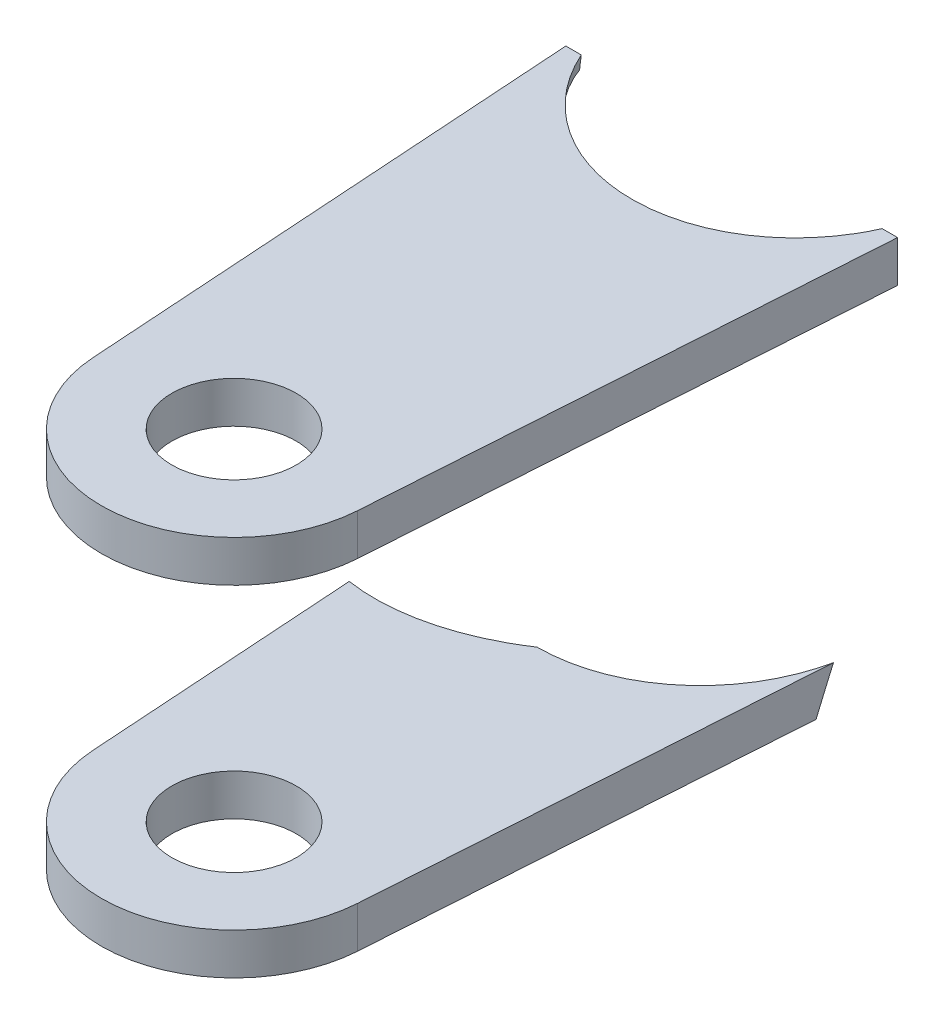
ISO-10303-21;
HEADER;
FILE_DESCRIPTION(('STEP AP214'),'2;1');
FILE_NAME('part.step','',(''),(''),'','','');
FILE_SCHEMA(('AUTOMOTIVE_DESIGN { 1 0 10303 214 1 1 1 1 }'));
ENDSEC;
DATA;
#1=APPLICATION_CONTEXT('core data for automotive mechanical design processes');
#2=APPLICATION_PROTOCOL_DEFINITION('international standard','automotive_design',2000,#1);
#3=PRODUCT_CONTEXT('',#1,'mechanical');
#4=PRODUCT('Part','Part','',(#3));
#5=PRODUCT_RELATED_PRODUCT_CATEGORY('part','',(#4));
#6=PRODUCT_DEFINITION_FORMATION('','',#4);
#7=PRODUCT_DEFINITION_CONTEXT('part definition',#1,'design');
#8=PRODUCT_DEFINITION('design','',#6,#7);
#9=PRODUCT_DEFINITION_SHAPE('','',#8);
#10=(LENGTH_UNIT() NAMED_UNIT(*) SI_UNIT(.MILLI.,.METRE.));
#11=(NAMED_UNIT(*) PLANE_ANGLE_UNIT() SI_UNIT($,.RADIAN.));
#12=(NAMED_UNIT(*) SI_UNIT($,.STERADIAN.) SOLID_ANGLE_UNIT());
#13=UNCERTAINTY_MEASURE_WITH_UNIT(LENGTH_MEASURE(1.E-05),#10,'distance_accuracy_value','');
#14=(GEOMETRIC_REPRESENTATION_CONTEXT(3) GLOBAL_UNCERTAINTY_ASSIGNED_CONTEXT((#13)) GLOBAL_UNIT_ASSIGNED_CONTEXT((#10,
#11,#12)) REPRESENTATION_CONTEXT('',''));
#15=CARTESIAN_POINT('',(0.,0.,0.));
#16=DIRECTION('',(0.,0.,1.));
#17=DIRECTION('',(1.,0.,0.));
#18=AXIS2_PLACEMENT_3D('',#15,#16,#17);
#19=CARTESIAN_POINT('',(0.,-11.43,0.));
#20=DIRECTION('',(0.,1.,0.));
#21=DIRECTION('',(0.,0.,1.));
#22=AXIS2_PLACEMENT_3D('',#19,#20,#21);
#23=PLANE('',#22);
#24=CARTESIAN_POINT('',(0.,-11.43,0.));
#25=DIRECTION('',(0.,1.,0.));
#26=DIRECTION('',(0.,0.,1.));
#27=AXIS2_PLACEMENT_3D('',#24,#25,#26);
#28=CIRCLE('',#27,4.7625);
#29=CARTESIAN_POINT('',(0.,-11.43,4.7625));
#30=VERTEX_POINT('',#29);
#31=EDGE_CURVE('E219',#30,#30,#28,.T.);
#32=ORIENTED_EDGE('',*,*,#31,.F.);
#33=EDGE_LOOP('',(#32));
#34=FACE_BOUND('',#33,.T.);
#35=DIRECTION('',(0.065941170815567,0.,-0.997823512446701));
#36=VECTOR('',#35,1.);
#37=CARTESIAN_POINT('',(10.1378868864585,-11.43,0.669962295486161));
#38=LINE('',#37,#36);
#39=CARTESIAN_POINT('',(10.1378868864585,-11.43,0.669962295486162));
#40=VERTEX_POINT('',#39);
#41=CARTESIAN_POINT('',(12.395699428603,-11.43,-33.4953158362905));
#42=VERTEX_POINT('',#41);
#43=EDGE_CURVE('E214',#40,#42,#38,.T.);
#44=ORIENTED_EDGE('',*,*,#43,.T.);
#45=CARTESIAN_POINT('',(6.84625654488924E-13,-11.43,-36.3650046202835));
#46=DIRECTION('',(0.,1.,0.));
#47=DIRECTION('',(0.,0.,-1.));
#48=AXIS2_PLACEMENT_3D('',#45,#46,#47);
#49=ELLIPSE('',#48,13.1882595385154,12.7);
#50=CARTESIAN_POINT('',(0.0187698506159406,-11.4299999999997,-23.1767594853977));
#51=VERTEX_POINT('',#50);
#52=EDGE_CURVE('E150',#42,#51,#49,.F.);
#53=ORIENTED_EDGE('',*,*,#52,.T.);
#54=CARTESIAN_POINT('',(-6.3980891267826,-11.43,-34.2101718485152));
#55=DIRECTION('',(0.,1.,0.));
#56=DIRECTION('',(-0.766871698259869,0.,0.641800435032593));
#57=AXIS2_PLACEMENT_3D('',#54,#55,#56);
#58=ELLIPSE('',#57,15.7233905378156,12.7);
#59=CARTESIAN_POINT('',(-11.5267302875876,-11.43,-20.3460521854983));
#60=VERTEX_POINT('',#59);
#61=EDGE_CURVE('E224',#51,#60,#58,.F.);
#62=ORIENTED_EDGE('',*,*,#61,.T.);
#63=DIRECTION('',(-0.065941170815567,0.,-0.997823512446701));
#64=VECTOR('',#63,1.);
#65=CARTESIAN_POINT('',(-10.1378868864585,-11.43,0.669962295486161));
#66=LINE('',#65,#64);
#67=CARTESIAN_POINT('',(-10.1378868864585,-11.43,0.669962295486162));
#68=VERTEX_POINT('',#67);
#69=EDGE_CURVE('E217',#68,#60,#66,.T.);
#70=ORIENTED_EDGE('',*,*,#69,.F.);
#71=CARTESIAN_POINT('',(0.,-11.43,0.));
#72=DIRECTION('',(0.,1.,0.));
#73=DIRECTION('',(0.,0.,1.));
#74=AXIS2_PLACEMENT_3D('',#71,#72,#73);
#75=CIRCLE('',#74,10.16);
#76=EDGE_CURVE('E221',#68,#40,#75,.T.);
#77=ORIENTED_EDGE('',*,*,#76,.T.);
#78=EDGE_LOOP('',(#44,#53,#62,#70,#77));
#79=FACE_BOUND('',#78,.T.);
#80=ADVANCED_FACE('F146',(#34,#79),#23,.T.);
#81=CARTESIAN_POINT('',(0.,-14.605,0.));
#82=DIRECTION('',(0.,1.,0.));
#83=DIRECTION('',(0.,0.,1.));
#84=AXIS2_PLACEMENT_3D('',#81,#82,#83);
#85=PLANE('',#84);
#86=CARTESIAN_POINT('',(6.99439360225216E-13,-14.605,-35.4761785104889));
#87=DIRECTION('',(0.,1.,0.));
#88=DIRECTION('',(0.,0.,-1.));
#89=AXIS2_PLACEMENT_3D('',#86,#87,#88);
#90=ELLIPSE('',#89,13.1882595385154,12.7);
#91=CARTESIAN_POINT('',(12.3131254611271,-14.605,-32.2458044120263));
#92=VERTEX_POINT('',#91);
#93=CARTESIAN_POINT('',(-0.865010533108423,-14.6049999999997,-22.3185454744574));
#94=VERTEX_POINT('',#93);
#95=EDGE_CURVE('E13',#92,#94,#90,.F.);
#96=ORIENTED_EDGE('',*,*,#95,.F.);
#97=DIRECTION('',(0.065941170815567,0.,-0.997823512446701));
#98=VECTOR('',#97,1.);
#99=CARTESIAN_POINT('',(10.1378868864585,-14.605,0.669962295486161));
#100=LINE('',#99,#98);
#101=CARTESIAN_POINT('',(10.1378868864585,-14.605,0.669962295486162));
#102=VERTEX_POINT('',#101);
#103=EDGE_CURVE('E195',#102,#92,#100,.T.);
#104=ORIENTED_EDGE('',*,*,#103,.F.);
#105=CARTESIAN_POINT('',(0.,-14.605,0.));
#106=DIRECTION('',(0.,1.,0.));
#107=DIRECTION('',(0.,0.,1.));
#108=AXIS2_PLACEMENT_3D('',#105,#106,#107);
#109=CIRCLE('',#108,10.16);
#110=CARTESIAN_POINT('',(-10.1378868864585,-14.605,0.669962295486162));
#111=VERTEX_POINT('',#110);
#112=EDGE_CURVE('E194',#111,#102,#109,.T.);
#113=ORIENTED_EDGE('',*,*,#112,.F.);
#114=DIRECTION('',(-0.065941170815567,0.,-0.997823512446701));
#115=VECTOR('',#114,1.);
#116=CARTESIAN_POINT('',(-10.1378868864585,-14.605,0.669962295486161));
#117=LINE('',#116,#115);
#118=CARTESIAN_POINT('',(-11.417953662969,-14.605,-18.7000414716071));
#119=VERTEX_POINT('',#118);
#120=EDGE_CURVE('E211',#111,#119,#117,.T.);
#121=ORIENTED_EDGE('',*,*,#120,.T.);
#122=CARTESIAN_POINT('',(-8.17533610644443,-14.605,-32.7227810798956));
#123=DIRECTION('',(0.,1.,0.));
#124=DIRECTION('',(-0.766871698259869,0.,0.641800435032593));
#125=AXIS2_PLACEMENT_3D('',#122,#123,#124);
#126=ELLIPSE('',#125,15.7233905378156,12.7);
#127=EDGE_CURVE('E204',#94,#119,#126,.F.);
#128=ORIENTED_EDGE('',*,*,#127,.F.);
#129=EDGE_LOOP('',(#96,#104,#113,#121,#128));
#130=FACE_BOUND('',#129,.T.);
#131=CARTESIAN_POINT('',(0.,-14.605,0.));
#132=DIRECTION('',(0.,1.,0.));
#133=DIRECTION('',(0.,0.,1.));
#134=AXIS2_PLACEMENT_3D('',#131,#132,#133);
#135=CIRCLE('',#134,4.7625);
#136=CARTESIAN_POINT('',(0.,-14.605,4.7625));
#137=VERTEX_POINT('',#136);
#138=EDGE_CURVE('E208',#137,#137,#135,.T.);
#139=ORIENTED_EDGE('',*,*,#138,.T.);
#140=EDGE_LOOP('',(#139));
#141=FACE_BOUND('',#140,.T.);
#142=ADVANCED_FACE('F200',(#130,#141),#85,.F.);
#143=CARTESIAN_POINT('',(10.1378868864585,-14.605,0.669962295486161));
#144=DIRECTION('',(0.997823512446701,0.,0.065941170815567));
#145=DIRECTION('',(0.065941170815567,0.,-0.997823512446701));
#146=AXIS2_PLACEMENT_3D('',#143,#144,#145);
#147=PLANE('',#146);
#148=ORIENTED_EDGE('',*,*,#103,.T.);
#149=CARTESIAN_POINT('',(3.85864112484633E-12,-691.712118315301,154.076730430113));
#150=DIRECTION('',(0.997823512446701,0.,0.065941170815567));
#151=DIRECTION('',(0.0177406009551015,0.963129900574879,-0.268451235229746));
#152=AXIS2_PLACEMENT_3D('',#149,#150,#151);
#153=ELLIPSE('',#152,714.426831977597,12.7);
#154=EDGE_CURVE('E188',#92,#42,#153,.F.);
#155=ORIENTED_EDGE('',*,*,#154,.T.);
#156=ORIENTED_EDGE('',*,*,#43,.F.);
#157=DIRECTION('',(0.,1.,0.));
#158=VECTOR('',#157,1.);
#159=CARTESIAN_POINT('',(10.1378868864585,-14.605,0.669962295486162));
#160=LINE('',#159,#158);
#161=EDGE_CURVE('E206',#102,#40,#160,.T.);
#162=ORIENTED_EDGE('',*,*,#161,.F.);
#163=EDGE_LOOP('',(#148,#155,#156,#162));
#164=FACE_BOUND('',#163,.T.);
#165=ADVANCED_FACE('F205',(#164),#147,.T.);
#166=CARTESIAN_POINT('',(0.,-14.605,0.));
#167=DIRECTION('',(0.,1.,0.));
#168=DIRECTION('',(0.,0.,1.));
#169=AXIS2_PLACEMENT_3D('',#166,#167,#168);
#170=CYLINDRICAL_SURFACE('',#169,10.16);
#171=ORIENTED_EDGE('',*,*,#76,.F.);
#172=DIRECTION('',(0.,1.,0.));
#173=VECTOR('',#172,1.);
#174=CARTESIAN_POINT('',(-10.1378868864585,-14.605,0.669962295486162));
#175=LINE('',#174,#173);
#176=EDGE_CURVE('E220',#111,#68,#175,.T.);
#177=ORIENTED_EDGE('',*,*,#176,.F.);
#178=ORIENTED_EDGE('',*,*,#112,.T.);
#179=ORIENTED_EDGE('',*,*,#161,.T.);
#180=EDGE_LOOP('',(#171,#177,#178,#179));
#181=FACE_BOUND('',#180,.T.);
#182=ADVANCED_FACE('F250',(#181),#170,.T.);
#183=CARTESIAN_POINT('',(-10.1378868864585,-14.605,0.669962295486161));
#184=DIRECTION('',(0.997823512446701,0.,-0.065941170815567));
#185=DIRECTION('',(-0.065941170815567,0.,-0.997823512446701));
#186=AXIS2_PLACEMENT_3D('',#183,#184,#185);
#187=PLANE('',#186);
#188=CARTESIAN_POINT('',(-12.1261393338043,-21.6629949722319,-29.4163254683489));
#189=DIRECTION('',(0.997823512446701,0.,-0.065941170815567));
#190=DIRECTION('',(0.0260761151254162,-0.918489600399509,0.394584452529387));
#191=AXIS2_PLACEMENT_3D('',#188,#189,#190);
#192=ELLIPSE('',#191,26.6753169357552,12.7);
#193=EDGE_CURVE('E156',#119,#60,#192,.F.);
#194=ORIENTED_EDGE('',*,*,#193,.F.);
#195=ORIENTED_EDGE('',*,*,#120,.F.);
#196=ORIENTED_EDGE('',*,*,#176,.T.);
#197=ORIENTED_EDGE('',*,*,#69,.T.);
#198=EDGE_LOOP('',(#194,#195,#196,#197));
#199=FACE_BOUND('',#198,.T.);
#200=ADVANCED_FACE('F248',(#199),#187,.F.);
#201=CARTESIAN_POINT('',(0.,-14.605,0.));
#202=DIRECTION('',(0.,1.,0.));
#203=DIRECTION('',(0.,0.,1.));
#204=AXIS2_PLACEMENT_3D('',#201,#202,#203);
#205=CYLINDRICAL_SURFACE('',#204,4.7625);
#206=ORIENTED_EDGE('',*,*,#138,.F.);
#207=EDGE_LOOP('',(#206));
#208=FACE_BOUND('',#207,.T.);
#209=ORIENTED_EDGE('',*,*,#31,.T.);
#210=EDGE_LOOP('',(#209));
#211=FACE_BOUND('',#210,.T.);
#212=ADVANCED_FACE('F241',(#208,#211),#205,.F.);
#213=CARTESIAN_POINT('',(0.,0.,-39.5647786155456));
#214=DIRECTION('',(-0.452128178178227,-0.807713830516125,0.378389321321581));
#215=DIRECTION('',(-0.889431307788424,0.440147131441255,-0.123217090575167));
#216=AXIS2_PLACEMENT_3D('',#213,#214,#215);
#217=CYLINDRICAL_SURFACE('',#216,12.7);
#218=CARTESIAN_POINT('',(0.,0.,-39.5647786155457));
#219=DIRECTION('',(-0.922199851791725,0.316689681614929,0.221934852859925));
#220=DIRECTION('',(-0.233178653920448,-0.913208887206712,0.334181453229419));
#221=AXIS2_PLACEMENT_3D('',#218,#219,#220);
#222=ELLIPSE('',#221,51.8080433073034,12.7);
#223=EDGE_CURVE('E162',#51,#94,#222,.F.);
#224=ORIENTED_EDGE('',*,*,#223,.T.);
#225=ORIENTED_EDGE('',*,*,#127,.T.);
#226=ORIENTED_EDGE('',*,*,#193,.T.);
#227=ORIENTED_EDGE('',*,*,#61,.F.);
#228=EDGE_LOOP('',(#224,#225,#226,#227));
#229=FACE_BOUND('',#228,.T.);
#230=ADVANCED_FACE('F245',(#229),#217,.F.);
#231=CARTESIAN_POINT('',(1.65839564303383E-12,-220.136705038398,22.0614422229685));
#232=DIRECTION('',(0.,0.962977712328952,-0.269581018541175));
#233=DIRECTION('',(1.,0.,0.));
#234=AXIS2_PLACEMENT_3D('',#231,#232,#233);
#235=CYLINDRICAL_SURFACE('',#234,12.7);
#236=ORIENTED_EDGE('',*,*,#52,.F.);
#237=ORIENTED_EDGE('',*,*,#154,.F.);
#238=ORIENTED_EDGE('',*,*,#95,.T.);
#239=ORIENTED_EDGE('',*,*,#223,.F.);
#240=EDGE_LOOP('',(#236,#237,#238,#239));
#241=FACE_BOUND('',#240,.T.);
#242=ADVANCED_FACE('F148',(#241),#235,.F.);
#243=CLOSED_SHELL('',(#80,#142,#165,#182,#200,#212,#230,#242));
#244=MANIFOLD_SOLID_BREP('B2',#243);
#245=CARTESIAN_POINT('',(0.,14.605,-38.1));
#246=DIRECTION('',(0.,0.,-1.));
#247=DIRECTION('',(-1.,0.,0.));
#248=AXIS2_PLACEMENT_3D('',#245,#246,#247);
#249=PLANE('',#248);
#250=DIRECTION('',(1.,0.,0.));
#251=VECTOR('',#250,1.);
#252=CARTESIAN_POINT('',(0.,14.605,-38.1));
#253=LINE('',#252,#251);
#254=CARTESIAN_POINT('',(-12.7,14.605,-38.1));
#255=VERTEX_POINT('',#254);
#256=CARTESIAN_POINT('',(-11.5191687962055,14.605,-38.1));
#257=VERTEX_POINT('',#256);
#258=EDGE_CURVE('E421',#255,#257,#253,.T.);
#259=ORIENTED_EDGE('',*,*,#258,.T.);
#260=CARTESIAN_POINT('',(6.55709187335536E-13,-5.23237566167681,-38.1));
#261=DIRECTION('',(0.,0.,-1.));
#262=DIRECTION('',(0.,1.,0.));
#263=AXIS2_PLACEMENT_3D('',#260,#261,#262);
#264=ELLIPSE('',#263,47.110141762671,12.7);
#265=CARTESIAN_POINT('',(-11.6484647986321,13.5373700891487,-38.1));
#266=VERTEX_POINT('',#265);
#267=EDGE_CURVE('E347',#257,#266,#264,.F.);
#268=ORIENTED_EDGE('',*,*,#267,.T.);
#269=CARTESIAN_POINT('',(-4.69003661605366,0.410057788524692,-38.1));
#270=DIRECTION('',(0.,0.,-1.));
#271=DIRECTION('',(0.996199625093029,-0.0870994085198601,0.));
#272=AXIS2_PLACEMENT_3D('',#269,#270,#271);
#273=ELLIPSE('',#272,42.7489747236034,12.7);
#274=CARTESIAN_POINT('',(-12.7,13.5649950966647,-38.1));
#275=VERTEX_POINT('',#274);
#276=EDGE_CURVE('E374',#266,#275,#273,.F.);
#277=ORIENTED_EDGE('',*,*,#276,.T.);
#278=DIRECTION('',(0.,-1.,0.));
#279=VECTOR('',#278,1.);
#280=CARTESIAN_POINT('',(-12.7,14.605,-38.1));
#281=LINE('',#280,#279);
#282=EDGE_CURVE('E333',#255,#275,#281,.T.);
#283=ORIENTED_EDGE('',*,*,#282,.F.);
#284=EDGE_LOOP('',(#259,#268,#277,#283));
#285=FACE_BOUND('',#284,.T.);
#286=ADVANCED_FACE('F329',(#285),#249,.T.);
#287=CARTESIAN_POINT('',(0.,11.43,0.));
#288=DIRECTION('',(0.,1.,0.));
#289=DIRECTION('',(0.,0.,1.));
#290=AXIS2_PLACEMENT_3D('',#287,#288,#289);
#291=PLANE('',#290);
#292=CARTESIAN_POINT('',(5.77966973187616E-13,11.43,-42.7645526108045));
#293=DIRECTION('',(0.,1.,0.));
#294=DIRECTION('',(0.,0.,-1.));
#295=AXIS2_PLACEMENT_3D('',#292,#293,#294);
#296=ELLIPSE('',#295,13.1882595385154,12.7);
#297=CARTESIAN_POINT('',(11.8791073706736,11.43,-38.1));
#298=VERTEX_POINT('',#297);
#299=CARTESIAN_POINT('',(-5.35375355601051,11.43,-30.8054039103828));
#300=VERTEX_POINT('',#299);
#301=EDGE_CURVE('E144',#298,#300,#296,.F.);
#302=ORIENTED_EDGE('',*,*,#301,.F.);
#303=DIRECTION('',(1.,0.,0.));
#304=VECTOR('',#303,1.);
#305=CARTESIAN_POINT('',(0.,11.43,-38.1));
#306=LINE('',#305,#304);
#307=CARTESIAN_POINT('',(12.7,11.43,-38.1));
#308=VERTEX_POINT('',#307);
#309=EDGE_CURVE('E418',#298,#308,#306,.T.);
#310=ORIENTED_EDGE('',*,*,#309,.T.);
#311=DIRECTION('',(0.065941170815567,0.,-0.997823512446701));
#312=VECTOR('',#311,1.);
#313=CARTESIAN_POINT('',(10.1378868864585,11.43,0.669962295486161));
#314=LINE('',#313,#312);
#315=CARTESIAN_POINT('',(10.1378868864585,11.43,0.669962295486162));
#316=VERTEX_POINT('',#315);
#317=EDGE_CURVE('E388',#316,#308,#314,.T.);
#318=ORIENTED_EDGE('',*,*,#317,.F.);
#319=CARTESIAN_POINT('',(0.,11.43,0.));
#320=DIRECTION('',(0.,1.,0.));
#321=DIRECTION('',(0.,0.,1.));
#322=AXIS2_PLACEMENT_3D('',#319,#320,#321);
#323=CIRCLE('',#322,10.16);
#324=CARTESIAN_POINT('',(-10.1378868864585,11.43,0.669962295486162));
#325=VERTEX_POINT('',#324);
#326=EDGE_CURVE('E389',#325,#316,#323,.T.);
#327=ORIENTED_EDGE('',*,*,#326,.F.);
#328=DIRECTION('',(-0.065941170815567,0.,-0.997823512446701));
#329=VECTOR('',#328,1.);
#330=CARTESIAN_POINT('',(-10.1378868864585,11.43,0.669962295486161));
#331=LINE('',#330,#329);
#332=CARTESIAN_POINT('',(-12.0197514839413,11.43,-27.80646175621));
#333=VERTEX_POINT('',#332);
#334=EDGE_CURVE('E382',#325,#333,#331,.T.);
#335=ORIENTED_EDGE('',*,*,#334,.T.);
#336=CARTESIAN_POINT('',(-130.730643391418,11.43,1.26463627235491));
#337=DIRECTION('',(0.,1.,0.));
#338=DIRECTION('',(0.954529669380213,0.,-0.298115934282121));
#339=AXIS2_PLACEMENT_3D('',#336,#337,#338);
#340=ELLIPSE('',#339,152.704779092073,12.7);
#341=EDGE_CURVE('E339',#300,#333,#340,.F.);
#342=ORIENTED_EDGE('',*,*,#341,.F.);
#343=EDGE_LOOP('',(#302,#310,#318,#327,#335,#342));
#344=FACE_BOUND('',#343,.T.);
#345=CARTESIAN_POINT('',(0.,11.43,0.));
#346=DIRECTION('',(0.,1.,0.));
#347=DIRECTION('',(0.,0.,1.));
#348=AXIS2_PLACEMENT_3D('',#345,#346,#347);
#349=CIRCLE('',#348,4.7625);
#350=CARTESIAN_POINT('',(0.,11.43,4.7625));
#351=VERTEX_POINT('',#350);
#352=EDGE_CURVE('E398',#351,#351,#349,.T.);
#353=ORIENTED_EDGE('',*,*,#352,.T.);
#354=EDGE_LOOP('',(#353));
#355=FACE_BOUND('',#354,.T.);
#356=ADVANCED_FACE('F378',(#344,#355),#291,.F.);
#357=ORIENTED_EDGE('',*,*,#309,.F.);
#358=CARTESIAN_POINT('',(11.5191687962066,14.605,-38.1));
#359=VERTEX_POINT('',#358);
#360=EDGE_CURVE('E358',#298,#359,#264,.F.);
#361=ORIENTED_EDGE('',*,*,#360,.T.);
#362=CARTESIAN_POINT('',(12.7,14.605,-38.1));
#363=VERTEX_POINT('',#362);
#364=EDGE_CURVE('E397',#359,#363,#253,.T.);
#365=ORIENTED_EDGE('',*,*,#364,.T.);
#366=DIRECTION('',(0.,-1.,0.));
#367=VECTOR('',#366,1.);
#368=CARTESIAN_POINT('',(12.7,14.605,-38.1));
#369=LINE('',#368,#367);
#370=EDGE_CURVE('E394',#363,#308,#369,.T.);
#371=ORIENTED_EDGE('',*,*,#370,.T.);
#372=EDGE_LOOP('',(#357,#361,#365,#371));
#373=FACE_BOUND('',#372,.T.);
#374=ADVANCED_FACE('F434',(#373),#249,.T.);
#375=CARTESIAN_POINT('',(-10.1378868864585,14.605,0.669962295486161));
#376=DIRECTION('',(-0.997823512446701,0.,0.065941170815567));
#377=DIRECTION('',(0.065941170815567,0.,0.997823512446701));
#378=AXIS2_PLACEMENT_3D('',#375,#376,#377);
#379=PLANE('',#378);
#380=ORIENTED_EDGE('',*,*,#282,.T.);
#381=CARTESIAN_POINT('',(-12.5380216961126,1.09622032194462,-35.6489400912042));
#382=DIRECTION('',(-0.997823512446701,0.,0.065941170815567));
#383=DIRECTION('',(-0.0621249078650128,-0.335258306947819,-0.940075722186913));
#384=AXIS2_PLACEMENT_3D('',#381,#382,#383);
#385=ELLIPSE('',#384,13.1097788473589,12.7);
#386=EDGE_CURVE('E416',#275,#333,#385,.F.);
#387=ORIENTED_EDGE('',*,*,#386,.T.);
#388=ORIENTED_EDGE('',*,*,#334,.F.);
#389=DIRECTION('',(0.,-1.,0.));
#390=VECTOR('',#389,1.);
#391=CARTESIAN_POINT('',(-10.1378868864585,14.605,0.669962295486162));
#392=LINE('',#391,#390);
#393=CARTESIAN_POINT('',(-10.1378868864585,14.605,0.669962295486162));
#394=VERTEX_POINT('',#393);
#395=EDGE_CURVE('E385',#394,#325,#392,.T.);
#396=ORIENTED_EDGE('',*,*,#395,.F.);
#397=DIRECTION('',(-0.065941170815567,0.,-0.997823512446701));
#398=VECTOR('',#397,1.);
#399=CARTESIAN_POINT('',(-10.1378868864585,14.605,0.669962295486161));
#400=LINE('',#399,#398);
#401=EDGE_CURVE('E405',#394,#255,#400,.T.);
#402=ORIENTED_EDGE('',*,*,#401,.T.);
#403=EDGE_LOOP('',(#380,#387,#388,#396,#402));
#404=FACE_BOUND('',#403,.T.);
#405=ADVANCED_FACE('F460',(#404),#379,.T.);
#406=CARTESIAN_POINT('',(0.,14.605,0.));
#407=DIRECTION('',(0.,-1.,0.));
#408=DIRECTION('',(0.,0.,-1.));
#409=AXIS2_PLACEMENT_3D('',#406,#407,#408);
#410=CYLINDRICAL_SURFACE('',#409,10.16);
#411=ORIENTED_EDGE('',*,*,#326,.T.);
#412=DIRECTION('',(0.,-1.,0.));
#413=VECTOR('',#412,1.);
#414=CARTESIAN_POINT('',(10.1378868864585,14.605,0.669962295486162));
#415=LINE('',#414,#413);
#416=CARTESIAN_POINT('',(10.1378868864585,14.605,0.669962295486162));
#417=VERTEX_POINT('',#416);
#418=EDGE_CURVE('E390',#417,#316,#415,.T.);
#419=ORIENTED_EDGE('',*,*,#418,.F.);
#420=CARTESIAN_POINT('',(0.,14.605,0.));
#421=DIRECTION('',(0.,1.,0.));
#422=DIRECTION('',(0.,0.,1.));
#423=AXIS2_PLACEMENT_3D('',#420,#421,#422);
#424=CIRCLE('',#423,10.16);
#425=EDGE_CURVE('E411',#394,#417,#424,.T.);
#426=ORIENTED_EDGE('',*,*,#425,.F.);
#427=ORIENTED_EDGE('',*,*,#395,.T.);
#428=EDGE_LOOP('',(#411,#419,#426,#427));
#429=FACE_BOUND('',#428,.T.);
#430=ADVANCED_FACE('F446',(#429),#410,.T.);
#431=CARTESIAN_POINT('',(10.1378868864585,14.605,0.669962295486161));
#432=DIRECTION('',(-0.997823512446701,0.,-0.065941170815567));
#433=DIRECTION('',(-0.065941170815567,0.,0.997823512446701));
#434=AXIS2_PLACEMENT_3D('',#431,#432,#433);
#435=PLANE('',#434);
#436=ORIENTED_EDGE('',*,*,#317,.T.);
#437=ORIENTED_EDGE('',*,*,#370,.F.);
#438=DIRECTION('',(0.065941170815567,0.,-0.997823512446701));
#439=VECTOR('',#438,1.);
#440=CARTESIAN_POINT('',(10.1378868864585,14.605,0.669962295486161));
#441=LINE('',#440,#439);
#442=EDGE_CURVE('E375',#417,#363,#441,.T.);
#443=ORIENTED_EDGE('',*,*,#442,.F.);
#444=ORIENTED_EDGE('',*,*,#418,.T.);
#445=EDGE_LOOP('',(#436,#437,#443,#444));
#446=FACE_BOUND('',#445,.T.);
#447=ADVANCED_FACE('F438',(#446),#435,.F.);
#448=CARTESIAN_POINT('',(0.,14.605,0.));
#449=DIRECTION('',(0.,-1.,0.));
#450=DIRECTION('',(0.,0.,-1.));
#451=AXIS2_PLACEMENT_3D('',#448,#449,#450);
#452=CYLINDRICAL_SURFACE('',#451,4.7625);
#453=CARTESIAN_POINT('',(0.,14.605,0.));
#454=DIRECTION('',(0.,1.,0.));
#455=DIRECTION('',(0.,0.,1.));
#456=AXIS2_PLACEMENT_3D('',#453,#454,#455);
#457=CIRCLE('',#456,4.7625);
#458=CARTESIAN_POINT('',(0.,14.605,4.7625));
#459=VERTEX_POINT('',#458);
#460=EDGE_CURVE('E393',#459,#459,#457,.T.);
#461=ORIENTED_EDGE('',*,*,#460,.T.);
#462=EDGE_LOOP('',(#461));
#463=FACE_BOUND('',#462,.T.);
#464=ORIENTED_EDGE('',*,*,#352,.F.);
#465=EDGE_LOOP('',(#464));
#466=FACE_BOUND('',#465,.T.);
#467=ADVANCED_FACE('F465',(#463,#466),#452,.F.);
#468=CARTESIAN_POINT('',(0.,14.605,0.));
#469=DIRECTION('',(0.,1.,0.));
#470=DIRECTION('',(0.,0.,1.));
#471=AXIS2_PLACEMENT_3D('',#468,#469,#470);
#472=PLANE('',#471);
#473=ORIENTED_EDGE('',*,*,#364,.F.);
#474=CARTESIAN_POINT('',(5.63153267451323E-13,14.605,-43.653378720599));
#475=DIRECTION('',(0.,1.,0.));
#476=DIRECTION('',(0.,0.,-1.));
#477=AXIS2_PLACEMENT_3D('',#474,#475,#476);
#478=ELLIPSE('',#477,13.1882595385154,12.7);
#479=EDGE_CURVE('E408',#359,#257,#478,.F.);
#480=ORIENTED_EDGE('',*,*,#479,.T.);
#481=ORIENTED_EDGE('',*,*,#258,.F.);
#482=ORIENTED_EDGE('',*,*,#401,.F.);
#483=ORIENTED_EDGE('',*,*,#425,.T.);
#484=ORIENTED_EDGE('',*,*,#442,.T.);
#485=EDGE_LOOP('',(#473,#480,#481,#482,#483,#484));
#486=FACE_BOUND('',#485,.T.);
#487=ORIENTED_EDGE('',*,*,#460,.F.);
#488=EDGE_LOOP('',(#487));
#489=FACE_BOUND('',#488,.T.);
#490=ADVANCED_FACE('F462',(#486,#489),#472,.T.);
#491=CARTESIAN_POINT('',(-117.475,10.2710368064183,-2.87532777581261));
#492=DIRECTION('',(0.951222818948762,-0.0831670107216657,-0.297083148358826));
#493=DIRECTION('',(-0.308504698037437,-0.256431616391803,-0.91600637410638));
#494=AXIS2_PLACEMENT_3D('',#491,#492,#493);
#495=CYLINDRICAL_SURFACE('',#494,12.7);
#496=CARTESIAN_POINT('',(0.,0.,-39.5647786155458));
#497=DIRECTION('',(0.672616105698053,0.622120113267009,-0.400692075070407));
#498=DIRECTION('',(0.672616105698053,-0.739736027771618,-0.0194469424911427));
#499=AXIS2_PLACEMENT_3D('',#496,#497,#498);
#500=ELLIPSE('',#499,17.9605122421383,12.7);
#501=EDGE_CURVE('E361',#266,#300,#500,.T.);
#502=ORIENTED_EDGE('',*,*,#501,.T.);
#503=ORIENTED_EDGE('',*,*,#341,.T.);
#504=ORIENTED_EDGE('',*,*,#386,.F.);
#505=ORIENTED_EDGE('',*,*,#276,.F.);
#506=EDGE_LOOP('',(#502,#503,#504,#505));
#507=FACE_BOUND('',#506,.T.);
#508=ADVANCED_FACE('F369',(#507),#495,.F.);
#509=CARTESIAN_POINT('',(1.65839564303383E-12,-220.136705038398,22.0614422229685));
#510=DIRECTION('',(0.,0.962977712328952,-0.269581018541175));
#511=DIRECTION('',(1.,0.,0.));
#512=AXIS2_PLACEMENT_3D('',#509,#510,#511);
#513=CYLINDRICAL_SURFACE('',#512,12.7);
#514=ORIENTED_EDGE('',*,*,#479,.F.);
#515=ORIENTED_EDGE('',*,*,#360,.F.);
#516=ORIENTED_EDGE('',*,*,#301,.T.);
#517=ORIENTED_EDGE('',*,*,#501,.F.);
#518=ORIENTED_EDGE('',*,*,#267,.F.);
#519=EDGE_LOOP('',(#514,#515,#516,#517,#518));
#520=FACE_BOUND('',#519,.T.);
#521=ADVANCED_FACE('F331',(#520),#513,.F.);
#522=CLOSED_SHELL('',(#286,#356,#374,#405,#430,#447,#467,#490,#508,#521));
#523=MANIFOLD_SOLID_BREP('B7',#522);
#524=ADVANCED_BREP_SHAPE_REPRESENTATION('',(#18,#244,#523),#14);
#525=SHAPE_DEFINITION_REPRESENTATION(#9,#524);
ENDSEC;
END-ISO-10303-21;
